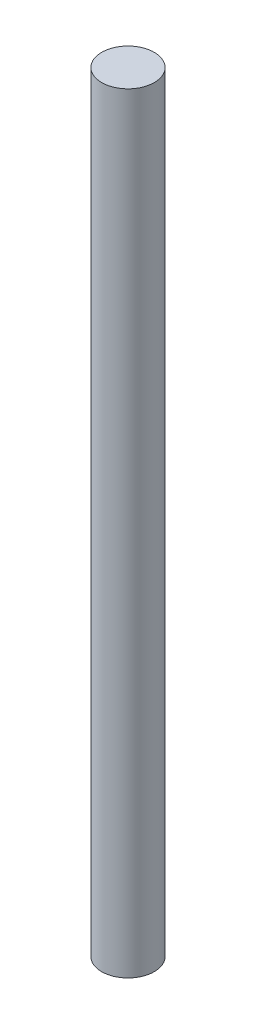
ISO-10303-21;
HEADER;
FILE_DESCRIPTION(('STEP AP214'),'2;1');
FILE_NAME('part.step','',(''),(''),'','','');
FILE_SCHEMA(('AUTOMOTIVE_DESIGN { 1 0 10303 214 1 1 1 1 }'));
ENDSEC;
DATA;
#1=APPLICATION_CONTEXT('core data for automotive mechanical design processes');
#2=APPLICATION_PROTOCOL_DEFINITION('international standard','automotive_design',2000,#1);
#3=PRODUCT_CONTEXT('',#1,'mechanical');
#4=PRODUCT('Part','Part','',(#3));
#5=PRODUCT_RELATED_PRODUCT_CATEGORY('part','',(#4));
#6=PRODUCT_DEFINITION_FORMATION('','',#4);
#7=PRODUCT_DEFINITION_CONTEXT('part definition',#1,'design');
#8=PRODUCT_DEFINITION('design','',#6,#7);
#9=PRODUCT_DEFINITION_SHAPE('','',#8);
#10=(LENGTH_UNIT() NAMED_UNIT(*) SI_UNIT(.MILLI.,.METRE.));
#11=(NAMED_UNIT(*) PLANE_ANGLE_UNIT() SI_UNIT($,.RADIAN.));
#12=(NAMED_UNIT(*) SI_UNIT($,.STERADIAN.) SOLID_ANGLE_UNIT());
#13=UNCERTAINTY_MEASURE_WITH_UNIT(LENGTH_MEASURE(1.E-05),#10,'distance_accuracy_value','');
#14=(GEOMETRIC_REPRESENTATION_CONTEXT(3) GLOBAL_UNCERTAINTY_ASSIGNED_CONTEXT((#13)) GLOBAL_UNIT_ASSIGNED_CONTEXT((#10,
#11,#12)) REPRESENTATION_CONTEXT('',''));
#15=CARTESIAN_POINT('',(0.,0.,0.));
#16=DIRECTION('',(0.,0.,1.));
#17=DIRECTION('',(1.,0.,0.));
#18=AXIS2_PLACEMENT_3D('',#15,#16,#17);
#19=CARTESIAN_POINT('',(0.,16.5,0.));
#20=DIRECTION('',(0.,-1.,0.));
#21=DIRECTION('',(0.,0.,-1.));
#22=AXIS2_PLACEMENT_3D('',#19,#20,#21);
#23=CYLINDRICAL_SURFACE('',#22,1.125);
#24=CARTESIAN_POINT('',(0.,16.5,0.));
#25=DIRECTION('',(0.,1.,0.));
#26=DIRECTION('',(0.,0.,1.));
#27=AXIS2_PLACEMENT_3D('',#24,#25,#26);
#28=CIRCLE('',#27,1.125);
#29=CARTESIAN_POINT('',(0.,16.5,1.125));
#30=VERTEX_POINT('',#29);
#31=EDGE_CURVE('E10',#30,#30,#28,.T.);
#32=ORIENTED_EDGE('',*,*,#31,.F.);
#33=EDGE_LOOP('',(#32));
#34=FACE_BOUND('',#33,.T.);
#35=CARTESIAN_POINT('',(0.,-16.5,0.));
#36=DIRECTION('',(0.,1.,0.));
#37=DIRECTION('',(0.,0.,1.));
#38=AXIS2_PLACEMENT_3D('',#35,#36,#37);
#39=CIRCLE('',#38,1.125);
#40=CARTESIAN_POINT('',(0.,-16.5,1.125));
#41=VERTEX_POINT('',#40);
#42=EDGE_CURVE('E35',#41,#41,#39,.T.);
#43=ORIENTED_EDGE('',*,*,#42,.T.);
#44=EDGE_LOOP('',(#43));
#45=FACE_BOUND('',#44,.T.);
#46=ADVANCED_FACE('F32',(#34,#45),#23,.T.);
#47=CARTESIAN_POINT('',(0.,16.5,0.));
#48=DIRECTION('',(0.,1.,0.));
#49=DIRECTION('',(0.,0.,1.));
#50=AXIS2_PLACEMENT_3D('',#47,#48,#49);
#51=PLANE('',#50);
#52=ORIENTED_EDGE('',*,*,#31,.T.);
#53=EDGE_LOOP('',(#52));
#54=FACE_BOUND('',#53,.T.);
#55=ADVANCED_FACE('F47',(#54),#51,.T.);
#56=CARTESIAN_POINT('',(0.,-16.5,0.));
#57=DIRECTION('',(0.,1.,0.));
#58=DIRECTION('',(0.,0.,1.));
#59=AXIS2_PLACEMENT_3D('',#56,#57,#58);
#60=PLANE('',#59);
#61=ORIENTED_EDGE('',*,*,#42,.F.);
#62=EDGE_LOOP('',(#61));
#63=FACE_BOUND('',#62,.T.);
#64=ADVANCED_FACE('F45',(#63),#60,.F.);
#65=CLOSED_SHELL('',(#46,#55,#64));
#66=MANIFOLD_SOLID_BREP('B2',#65);
#67=ADVANCED_BREP_SHAPE_REPRESENTATION('',(#18,#66),#14);
#68=SHAPE_DEFINITION_REPRESENTATION(#9,#67);
ENDSEC;
END-ISO-10303-21;
